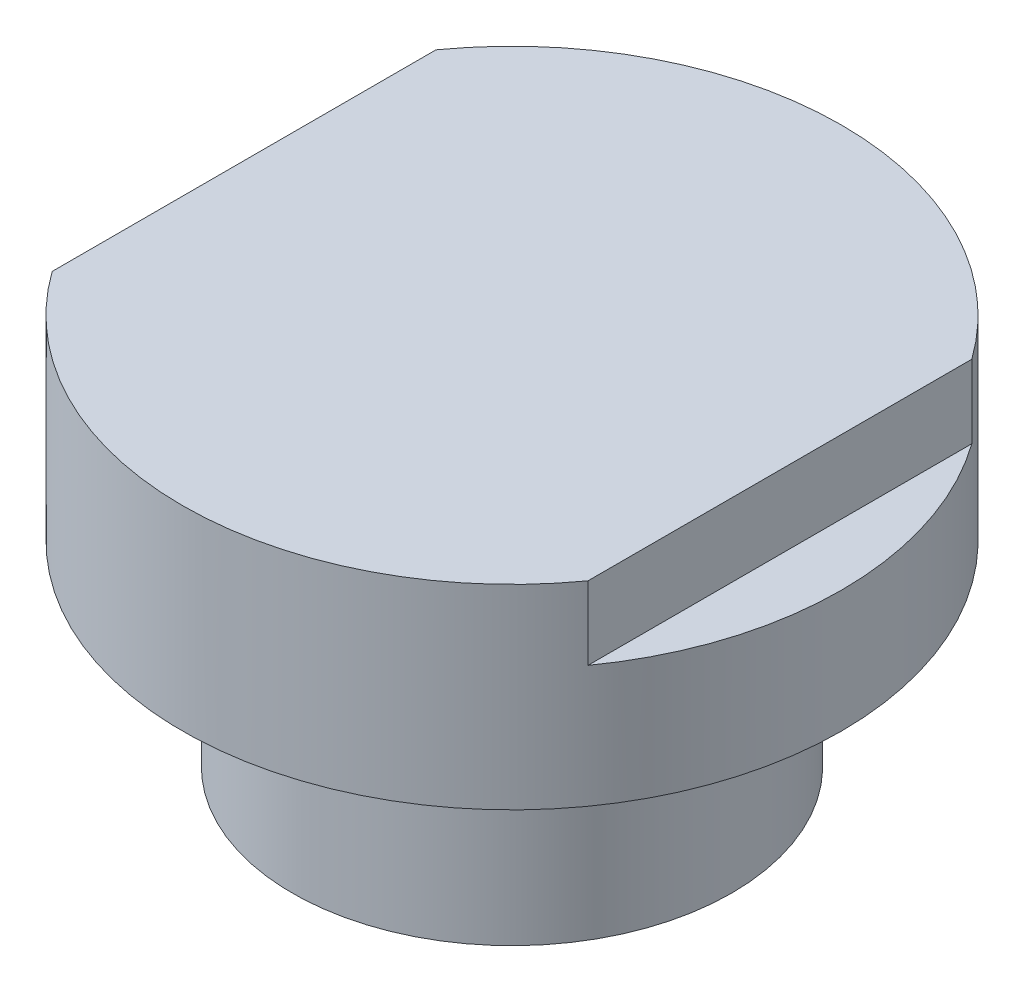
ISO-10303-21;
HEADER;
FILE_DESCRIPTION(('STEP AP214'),'2;1');
FILE_NAME('part.step','',(''),(''),'','','');
FILE_SCHEMA(('AUTOMOTIVE_DESIGN { 1 0 10303 214 1 1 1 1 }'));
ENDSEC;
DATA;
#1=APPLICATION_CONTEXT('core data for automotive mechanical design processes');
#2=APPLICATION_PROTOCOL_DEFINITION('international standard','automotive_design',2000,#1);
#3=PRODUCT_CONTEXT('',#1,'mechanical');
#4=PRODUCT('Part','Part','',(#3));
#5=PRODUCT_RELATED_PRODUCT_CATEGORY('part','',(#4));
#6=PRODUCT_DEFINITION_FORMATION('','',#4);
#7=PRODUCT_DEFINITION_CONTEXT('part definition',#1,'design');
#8=PRODUCT_DEFINITION('design','',#6,#7);
#9=PRODUCT_DEFINITION_SHAPE('','',#8);
#10=(LENGTH_UNIT() NAMED_UNIT(*) SI_UNIT(.MILLI.,.METRE.));
#11=(NAMED_UNIT(*) PLANE_ANGLE_UNIT() SI_UNIT($,.RADIAN.));
#12=(NAMED_UNIT(*) SI_UNIT($,.STERADIAN.) SOLID_ANGLE_UNIT());
#13=UNCERTAINTY_MEASURE_WITH_UNIT(LENGTH_MEASURE(1.E-05),#10,'distance_accuracy_value','');
#14=(GEOMETRIC_REPRESENTATION_CONTEXT(3) GLOBAL_UNCERTAINTY_ASSIGNED_CONTEXT((#13)) GLOBAL_UNIT_ASSIGNED_CONTEXT((#10,
#11,#12)) REPRESENTATION_CONTEXT('',''));
#15=CARTESIAN_POINT('',(0.,0.,0.));
#16=DIRECTION('',(0.,0.,1.));
#17=DIRECTION('',(1.,0.,0.));
#18=AXIS2_PLACEMENT_3D('',#15,#16,#17);
#19=CARTESIAN_POINT('',(0.,16.,0.));
#20=DIRECTION('',(0.,-1.,0.));
#21=DIRECTION('',(0.,0.,-1.));
#22=AXIS2_PLACEMENT_3D('',#19,#20,#21);
#23=PLANE('',#22);
#24=DIRECTION('',(0.,0.,1.));
#25=VECTOR('',#24,1.);
#26=CARTESIAN_POINT('',(10.975,16.,-7.861257851006));
#27=LINE('',#26,#25);
#28=CARTESIAN_POINT('',(10.975,16.,-7.861257851006));
#29=VERTEX_POINT('',#28);
#30=CARTESIAN_POINT('',(10.975,16.,7.861257851006));
#31=VERTEX_POINT('',#30);
#32=EDGE_CURVE('E142',#29,#31,#27,.T.);
#33=ORIENTED_EDGE('',*,*,#32,.F.);
#34=CARTESIAN_POINT('',(0.,16.,0.));
#35=DIRECTION('',(0.,1.,0.));
#36=DIRECTION('',(0.812962962962975,0.,-0.582315396370782));
#37=AXIS2_PLACEMENT_3D('',#34,#35,#36);
#38=CIRCLE('',#37,13.5);
#39=CARTESIAN_POINT('',(-10.975,16.,-7.861257851006));
#40=VERTEX_POINT('',#39);
#41=EDGE_CURVE('E168',#29,#40,#38,.T.);
#42=ORIENTED_EDGE('',*,*,#41,.T.);
#43=DIRECTION('',(0.,0.,-1.));
#44=VECTOR('',#43,1.);
#45=CARTESIAN_POINT('',(-10.975,16.,7.861257851006));
#46=LINE('',#45,#44);
#47=CARTESIAN_POINT('',(-10.975,16.,7.861257851006));
#48=VERTEX_POINT('',#47);
#49=EDGE_CURVE('E11',#48,#40,#46,.T.);
#50=ORIENTED_EDGE('',*,*,#49,.F.);
#51=CARTESIAN_POINT('',(0.,16.,0.));
#52=DIRECTION('',(0.,-1.,0.));
#53=DIRECTION('',(0.812962962962975,0.,0.582315396370782));
#54=AXIS2_PLACEMENT_3D('',#51,#52,#53);
#55=CIRCLE('',#54,13.5);
#56=EDGE_CURVE('E161',#31,#48,#55,.T.);
#57=ORIENTED_EDGE('',*,*,#56,.F.);
#58=EDGE_LOOP('',(#33,#42,#50,#57));
#59=FACE_BOUND('',#58,.T.);
#60=ADVANCED_FACE('F17',(#59),#23,.F.);
#61=CARTESIAN_POINT('',(-10.975,16.,7.861257851006));
#62=DIRECTION('',(1.,0.,0.));
#63=DIRECTION('',(0.,1.,0.));
#64=AXIS2_PLACEMENT_3D('',#61,#62,#63);
#65=PLANE('',#64);
#66=DIRECTION('',(0.,-1.,0.));
#67=VECTOR('',#66,1.);
#68=CARTESIAN_POINT('',(-10.975,16.,7.861257851006));
#69=LINE('',#68,#67);
#70=CARTESIAN_POINT('',(-10.975,13.,7.861257851006));
#71=VERTEX_POINT('',#70);
#72=EDGE_CURVE('E196',#48,#71,#69,.T.);
#73=ORIENTED_EDGE('',*,*,#72,.F.);
#74=ORIENTED_EDGE('',*,*,#49,.T.);
#75=DIRECTION('',(0.,-1.,0.));
#76=VECTOR('',#75,1.);
#77=CARTESIAN_POINT('',(-10.975,16.,-7.861257851006));
#78=LINE('',#77,#76);
#79=CARTESIAN_POINT('',(-10.975,13.,-7.861257851006));
#80=VERTEX_POINT('',#79);
#81=EDGE_CURVE('E165',#40,#80,#78,.T.);
#82=ORIENTED_EDGE('',*,*,#81,.T.);
#83=DIRECTION('',(0.,0.,-1.));
#84=VECTOR('',#83,1.);
#85=CARTESIAN_POINT('',(-10.975,13.,7.861257851006));
#86=LINE('',#85,#84);
#87=EDGE_CURVE('E28',#71,#80,#86,.T.);
#88=ORIENTED_EDGE('',*,*,#87,.F.);
#89=EDGE_LOOP('',(#73,#74,#82,#88));
#90=FACE_BOUND('',#89,.T.);
#91=ADVANCED_FACE('F214',(#90),#65,.F.);
#92=CARTESIAN_POINT('',(0.,13.,0.));
#93=DIRECTION('',(0.,1.,0.));
#94=DIRECTION('',(1.,0.,0.));
#95=AXIS2_PLACEMENT_3D('',#92,#93,#94);
#96=PLANE('',#95);
#97=CARTESIAN_POINT('',(0.,13.,0.));
#98=DIRECTION('',(0.,-1.,0.));
#99=DIRECTION('',(-1.,0.,0.));
#100=AXIS2_PLACEMENT_3D('',#97,#98,#99);
#101=CIRCLE('',#100,13.5);
#102=EDGE_CURVE('E169',#71,#80,#101,.T.);
#103=ORIENTED_EDGE('',*,*,#102,.F.);
#104=ORIENTED_EDGE('',*,*,#87,.T.);
#105=EDGE_LOOP('',(#103,#104));
#106=FACE_BOUND('',#105,.T.);
#107=ADVANCED_FACE('F217',(#106),#96,.T.);
#108=CARTESIAN_POINT('',(0.,13.,0.));
#109=DIRECTION('',(0.,1.,0.));
#110=DIRECTION('',(1.,0.,0.));
#111=AXIS2_PLACEMENT_3D('',#108,#109,#110);
#112=PLANE('',#111);
#113=CARTESIAN_POINT('',(0.,13.,0.));
#114=DIRECTION('',(0.,-1.,0.));
#115=DIRECTION('',(1.,0.,0.));
#116=AXIS2_PLACEMENT_3D('',#113,#114,#115);
#117=CIRCLE('',#116,13.5);
#118=CARTESIAN_POINT('',(10.975,13.,-7.861257851006));
#119=VERTEX_POINT('',#118);
#120=CARTESIAN_POINT('',(13.5,13.,0.));
#121=VERTEX_POINT('',#120);
#122=EDGE_CURVE('E143',#119,#121,#117,.T.);
#123=ORIENTED_EDGE('',*,*,#122,.F.);
#124=DIRECTION('',(0.,0.,1.));
#125=VECTOR('',#124,1.);
#126=CARTESIAN_POINT('',(10.975,13.,-7.861257851006));
#127=LINE('',#126,#125);
#128=CARTESIAN_POINT('',(10.975,13.,7.861257851006));
#129=VERTEX_POINT('',#128);
#130=EDGE_CURVE('E42',#119,#129,#127,.T.);
#131=ORIENTED_EDGE('',*,*,#130,.T.);
#132=CARTESIAN_POINT('',(0.,13.,0.));
#133=DIRECTION('',(0.,-1.,0.));
#134=DIRECTION('',(1.,0.,0.));
#135=AXIS2_PLACEMENT_3D('',#132,#133,#134);
#136=CIRCLE('',#135,13.5);
#137=EDGE_CURVE('E162',#121,#129,#136,.T.);
#138=ORIENTED_EDGE('',*,*,#137,.F.);
#139=EDGE_LOOP('',(#123,#131,#138));
#140=FACE_BOUND('',#139,.T.);
#141=ADVANCED_FACE('F288',(#140),#112,.T.);
#142=CARTESIAN_POINT('',(10.975,16.,-7.861257851006));
#143=DIRECTION('',(-1.,0.,0.));
#144=DIRECTION('',(0.,0.,1.));
#145=AXIS2_PLACEMENT_3D('',#142,#143,#144);
#146=PLANE('',#145);
#147=DIRECTION('',(0.,-1.,0.));
#148=VECTOR('',#147,1.);
#149=CARTESIAN_POINT('',(10.975,16.,7.861257851006));
#150=LINE('',#149,#148);
#151=EDGE_CURVE('E158',#31,#129,#150,.T.);
#152=ORIENTED_EDGE('',*,*,#151,.T.);
#153=ORIENTED_EDGE('',*,*,#130,.F.);
#154=DIRECTION('',(0.,-1.,0.));
#155=VECTOR('',#154,1.);
#156=CARTESIAN_POINT('',(10.975,16.,-7.861257851006));
#157=LINE('',#156,#155);
#158=EDGE_CURVE('E170',#29,#119,#157,.T.);
#159=ORIENTED_EDGE('',*,*,#158,.F.);
#160=ORIENTED_EDGE('',*,*,#32,.T.);
#161=EDGE_LOOP('',(#152,#153,#159,#160));
#162=FACE_BOUND('',#161,.T.);
#163=ADVANCED_FACE('F283',(#162),#146,.F.);
#164=CARTESIAN_POINT('',(0.,16.8,0.));
#165=DIRECTION('',(0.,-1.,0.));
#166=DIRECTION('',(-1.,0.,0.));
#167=AXIS2_PLACEMENT_3D('',#164,#165,#166);
#168=CYLINDRICAL_SURFACE('',#167,13.5);
#169=CARTESIAN_POINT('',(0.,8.,0.));
#170=DIRECTION('',(0.,1.,0.));
#171=DIRECTION('',(1.,0.,0.));
#172=AXIS2_PLACEMENT_3D('',#169,#170,#171);
#173=CIRCLE('',#172,13.5);
#174=CARTESIAN_POINT('',(13.5,8.,0.));
#175=VERTEX_POINT('',#174);
#176=EDGE_CURVE('E148',#175,#175,#173,.T.);
#177=ORIENTED_EDGE('',*,*,#176,.T.);
#178=DIRECTION('',(0.,1.,0.));
#179=VECTOR('',#178,1.);
#180=CARTESIAN_POINT('',(13.5,16.8,0.));
#181=LINE('',#180,#179);
#182=EDGE_CURVE('E154',#175,#121,#181,.T.);
#183=ORIENTED_EDGE('',*,*,#182,.T.);
#184=ORIENTED_EDGE('',*,*,#137,.T.);
#185=ORIENTED_EDGE('',*,*,#151,.F.);
#186=ORIENTED_EDGE('',*,*,#56,.T.);
#187=ORIENTED_EDGE('',*,*,#72,.T.);
#188=ORIENTED_EDGE('',*,*,#102,.T.);
#189=ORIENTED_EDGE('',*,*,#81,.F.);
#190=ORIENTED_EDGE('',*,*,#41,.F.);
#191=ORIENTED_EDGE('',*,*,#158,.T.);
#192=ORIENTED_EDGE('',*,*,#122,.T.);
#193=ORIENTED_EDGE('',*,*,#182,.F.);
#194=EDGE_LOOP('',(#177,#183,#184,#185,#186,#187,#188,#189,#190,#191,#192,#193));
#195=FACE_BOUND('',#194,.T.);
#196=ADVANCED_FACE('F209',(#195),#168,.T.);
#197=CARTESIAN_POINT('',(0.,8.,0.));
#198=DIRECTION('',(0.,-1.,0.));
#199=DIRECTION('',(0.,0.,-1.));
#200=AXIS2_PLACEMENT_3D('',#197,#198,#199);
#201=PLANE('',#200);
#202=CARTESIAN_POINT('',(0.,8.,0.));
#203=DIRECTION('',(0.,-1.,0.));
#204=DIRECTION('',(1.,0.,0.));
#205=AXIS2_PLACEMENT_3D('',#202,#203,#204);
#206=CIRCLE('',#205,12.3);
#207=CARTESIAN_POINT('',(12.3,8.,0.));
#208=VERTEX_POINT('',#207);
#209=EDGE_CURVE('E129',#208,#208,#206,.T.);
#210=ORIENTED_EDGE('',*,*,#209,.F.);
#211=EDGE_LOOP('',(#210));
#212=FACE_BOUND('',#211,.T.);
#213=ORIENTED_EDGE('',*,*,#176,.F.);
#214=EDGE_LOOP('',(#213));
#215=FACE_BOUND('',#214,.T.);
#216=ADVANCED_FACE('F304',(#212,#215),#201,.T.);
#217=CARTESIAN_POINT('',(0.,16.8,0.));
#218=DIRECTION('',(0.,-1.,0.));
#219=DIRECTION('',(-1.,0.,0.));
#220=AXIS2_PLACEMENT_3D('',#217,#218,#219);
#221=CYLINDRICAL_SURFACE('',#220,12.3);
#222=CARTESIAN_POINT('',(0.,9.5,0.));
#223=DIRECTION('',(0.,1.,0.));
#224=DIRECTION('',(1.,0.,0.));
#225=AXIS2_PLACEMENT_3D('',#222,#223,#224);
#226=CIRCLE('',#225,12.3);
#227=CARTESIAN_POINT('',(12.3,9.5,0.));
#228=VERTEX_POINT('',#227);
#229=EDGE_CURVE('E130',#228,#228,#226,.T.);
#230=ORIENTED_EDGE('',*,*,#229,.T.);
#231=DIRECTION('',(0.,-1.,0.));
#232=VECTOR('',#231,1.);
#233=CARTESIAN_POINT('',(12.3,16.8,0.));
#234=LINE('',#233,#232);
#235=EDGE_CURVE('E125',#228,#208,#234,.T.);
#236=ORIENTED_EDGE('',*,*,#235,.T.);
#237=ORIENTED_EDGE('',*,*,#209,.T.);
#238=ORIENTED_EDGE('',*,*,#235,.F.);
#239=EDGE_LOOP('',(#230,#236,#237,#238));
#240=FACE_BOUND('',#239,.T.);
#241=ADVANCED_FACE('F270',(#240),#221,.F.);
#242=CARTESIAN_POINT('',(0.,9.5,0.));
#243=DIRECTION('',(0.,-1.,0.));
#244=DIRECTION('',(0.,0.,-1.));
#245=AXIS2_PLACEMENT_3D('',#242,#243,#244);
#246=PLANE('',#245);
#247=CARTESIAN_POINT('',(0.,9.5,0.));
#248=DIRECTION('',(0.,-1.,0.));
#249=DIRECTION('',(1.,0.,0.));
#250=AXIS2_PLACEMENT_3D('',#247,#248,#249);
#251=CIRCLE('',#250,10.);
#252=CARTESIAN_POINT('',(10.,9.5,0.));
#253=VERTEX_POINT('',#252);
#254=EDGE_CURVE('E134',#253,#253,#251,.T.);
#255=ORIENTED_EDGE('',*,*,#254,.F.);
#256=EDGE_LOOP('',(#255));
#257=FACE_BOUND('',#256,.T.);
#258=ORIENTED_EDGE('',*,*,#229,.F.);
#259=EDGE_LOOP('',(#258));
#260=FACE_BOUND('',#259,.T.);
#261=ADVANCED_FACE('F265',(#257,#260),#246,.T.);
#262=CARTESIAN_POINT('',(0.,16.8,0.));
#263=DIRECTION('',(0.,-1.,0.));
#264=DIRECTION('',(-1.,0.,0.));
#265=AXIS2_PLACEMENT_3D('',#262,#263,#264);
#266=CYLINDRICAL_SURFACE('',#265,10.);
#267=CARTESIAN_POINT('',(0.,8.,0.));
#268=DIRECTION('',(0.,1.,0.));
#269=DIRECTION('',(1.,0.,0.));
#270=AXIS2_PLACEMENT_3D('',#267,#268,#269);
#271=CIRCLE('',#270,10.);
#272=CARTESIAN_POINT('',(10.,8.,0.));
#273=VERTEX_POINT('',#272);
#274=EDGE_CURVE('E110',#273,#273,#271,.T.);
#275=ORIENTED_EDGE('',*,*,#274,.T.);
#276=DIRECTION('',(0.,1.,0.));
#277=VECTOR('',#276,1.);
#278=CARTESIAN_POINT('',(10.,16.8,0.));
#279=LINE('',#278,#277);
#280=EDGE_CURVE('E21',#273,#253,#279,.T.);
#281=ORIENTED_EDGE('',*,*,#280,.T.);
#282=ORIENTED_EDGE('',*,*,#254,.T.);
#283=ORIENTED_EDGE('',*,*,#280,.F.);
#284=EDGE_LOOP('',(#275,#281,#282,#283));
#285=FACE_BOUND('',#284,.T.);
#286=ADVANCED_FACE('F239',(#285),#266,.T.);
#287=CARTESIAN_POINT('',(0.,8.,0.));
#288=DIRECTION('',(0.,-1.,0.));
#289=DIRECTION('',(0.,0.,-1.));
#290=AXIS2_PLACEMENT_3D('',#287,#288,#289);
#291=PLANE('',#290);
#292=CARTESIAN_POINT('',(0.,8.,0.));
#293=DIRECTION('',(0.,-1.,0.));
#294=DIRECTION('',(1.,0.,0.));
#295=AXIS2_PLACEMENT_3D('',#292,#293,#294);
#296=CIRCLE('',#295,8.);
#297=CARTESIAN_POINT('',(8.,8.,0.));
#298=VERTEX_POINT('',#297);
#299=EDGE_CURVE('E106',#298,#298,#296,.T.);
#300=ORIENTED_EDGE('',*,*,#299,.F.);
#301=EDGE_LOOP('',(#300));
#302=FACE_BOUND('',#301,.T.);
#303=ORIENTED_EDGE('',*,*,#274,.F.);
#304=EDGE_LOOP('',(#303));
#305=FACE_BOUND('',#304,.T.);
#306=ADVANCED_FACE('F234',(#302,#305),#291,.T.);
#307=CARTESIAN_POINT('',(0.,16.8,0.));
#308=DIRECTION('',(0.,-1.,0.));
#309=DIRECTION('',(-1.,0.,0.));
#310=AXIS2_PLACEMENT_3D('',#307,#308,#309);
#311=CYLINDRICAL_SURFACE('',#310,8.);
#312=CARTESIAN_POINT('',(0.,6.,0.));
#313=DIRECTION('',(0.,1.,0.));
#314=DIRECTION('',(1.,0.,0.));
#315=AXIS2_PLACEMENT_3D('',#312,#313,#314);
#316=CIRCLE('',#315,8.);
#317=CARTESIAN_POINT('',(8.,6.,0.));
#318=VERTEX_POINT('',#317);
#319=EDGE_CURVE('E119',#318,#318,#316,.T.);
#320=ORIENTED_EDGE('',*,*,#319,.T.);
#321=DIRECTION('',(0.,1.,0.));
#322=VECTOR('',#321,1.);
#323=CARTESIAN_POINT('',(8.,16.8,0.));
#324=LINE('',#323,#322);
#325=EDGE_CURVE('E102',#318,#298,#324,.T.);
#326=ORIENTED_EDGE('',*,*,#325,.T.);
#327=ORIENTED_EDGE('',*,*,#299,.T.);
#328=ORIENTED_EDGE('',*,*,#325,.F.);
#329=EDGE_LOOP('',(#320,#326,#327,#328));
#330=FACE_BOUND('',#329,.T.);
#331=ADVANCED_FACE('F107',(#330),#311,.T.);
#332=CARTESIAN_POINT('',(0.,6.,0.));
#333=DIRECTION('',(0.,-1.,0.));
#334=DIRECTION('',(0.,0.,-1.));
#335=AXIS2_PLACEMENT_3D('',#332,#333,#334);
#336=PLANE('',#335);
#337=ORIENTED_EDGE('',*,*,#319,.F.);
#338=EDGE_LOOP('',(#337));
#339=FACE_BOUND('',#338,.T.);
#340=CARTESIAN_POINT('',(0.,6.,0.));
#341=DIRECTION('',(0.,-1.,0.));
#342=DIRECTION('',(1.,0.,0.));
#343=AXIS2_PLACEMENT_3D('',#340,#341,#342);
#344=CIRCLE('',#343,9.);
#345=CARTESIAN_POINT('',(9.,6.,0.));
#346=VERTEX_POINT('',#345);
#347=EDGE_CURVE('E138',#346,#346,#344,.T.);
#348=ORIENTED_EDGE('',*,*,#347,.F.);
#349=EDGE_LOOP('',(#348));
#350=FACE_BOUND('',#349,.T.);
#351=ADVANCED_FACE('F228',(#339,#350),#336,.F.);
#352=CARTESIAN_POINT('',(0.,16.8,0.));
#353=DIRECTION('',(0.,-1.,0.));
#354=DIRECTION('',(-1.,0.,0.));
#355=AXIS2_PLACEMENT_3D('',#352,#353,#354);
#356=CYLINDRICAL_SURFACE('',#355,9.);
#357=CARTESIAN_POINT('',(0.,0.,0.));
#358=DIRECTION('',(0.,1.,0.));
#359=DIRECTION('',(1.,0.,0.));
#360=AXIS2_PLACEMENT_3D('',#357,#358,#359);
#361=CIRCLE('',#360,9.);
#362=CARTESIAN_POINT('',(9.,0.,0.));
#363=VERTEX_POINT('',#362);
#364=EDGE_CURVE('E123',#363,#363,#361,.T.);
#365=ORIENTED_EDGE('',*,*,#364,.T.);
#366=DIRECTION('',(0.,1.,0.));
#367=VECTOR('',#366,1.);
#368=CARTESIAN_POINT('',(9.,16.8,0.));
#369=LINE('',#368,#367);
#370=EDGE_CURVE('E135',#363,#346,#369,.T.);
#371=ORIENTED_EDGE('',*,*,#370,.T.);
#372=ORIENTED_EDGE('',*,*,#347,.T.);
#373=ORIENTED_EDGE('',*,*,#370,.F.);
#374=EDGE_LOOP('',(#365,#371,#372,#373));
#375=FACE_BOUND('',#374,.T.);
#376=ADVANCED_FACE('F19',(#375),#356,.T.);
#377=CARTESIAN_POINT('',(0.,0.,0.));
#378=DIRECTION('',(0.,-1.,0.));
#379=DIRECTION('',(0.,0.,-1.));
#380=AXIS2_PLACEMENT_3D('',#377,#378,#379);
#381=PLANE('',#380);
#382=ORIENTED_EDGE('',*,*,#364,.F.);
#383=EDGE_LOOP('',(#382));
#384=FACE_BOUND('',#383,.T.);
#385=ADVANCED_FACE('F227',(#384),#381,.T.);
#386=CLOSED_SHELL('',(#60,#91,#107,#141,#163,#196,#216,#241,#261,#286,#306,#331,#351,#376,#385));
#387=MANIFOLD_SOLID_BREP('B1',#386);
#388=ADVANCED_BREP_SHAPE_REPRESENTATION('',(#18,#387),#14);
#389=SHAPE_DEFINITION_REPRESENTATION(#9,#388);
ENDSEC;
END-ISO-10303-21;
